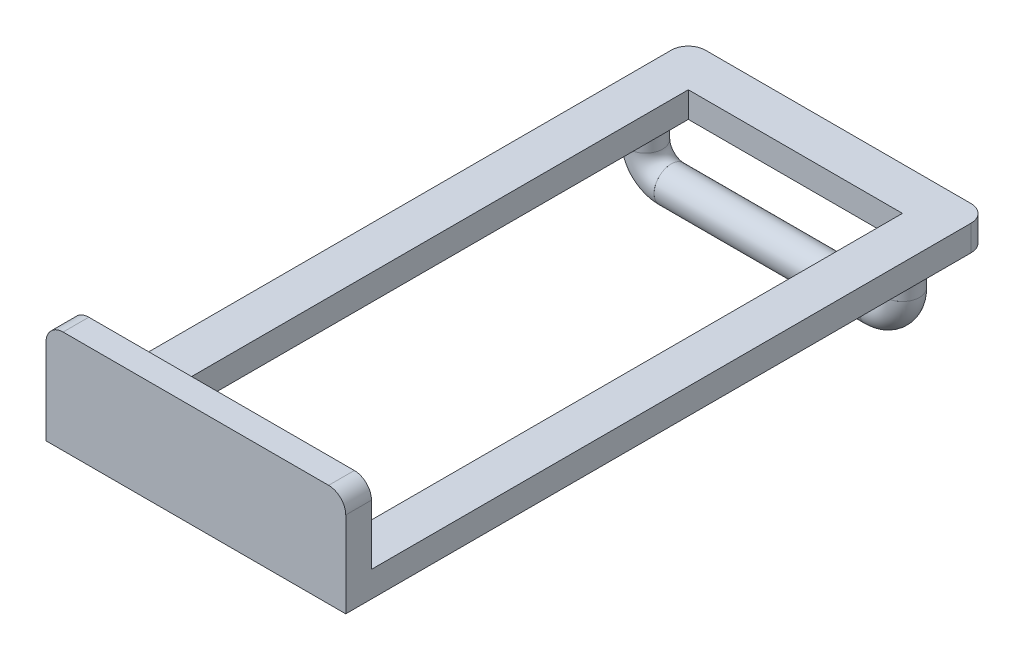
ISO-10303-21;
HEADER;
FILE_DESCRIPTION(('STEP AP214'),'2;1');
FILE_NAME('part.step','',(''),(''),'','','');
FILE_SCHEMA(('AUTOMOTIVE_DESIGN { 1 0 10303 214 1 1 1 1 }'));
ENDSEC;
DATA;
#1=APPLICATION_CONTEXT('core data for automotive mechanical design processes');
#2=APPLICATION_PROTOCOL_DEFINITION('international standard','automotive_design',2000,#1);
#3=PRODUCT_CONTEXT('',#1,'mechanical');
#4=PRODUCT('Part','Part','',(#3));
#5=PRODUCT_RELATED_PRODUCT_CATEGORY('part','',(#4));
#6=PRODUCT_DEFINITION_FORMATION('','',#4);
#7=PRODUCT_DEFINITION_CONTEXT('part definition',#1,'design');
#8=PRODUCT_DEFINITION('design','',#6,#7);
#9=PRODUCT_DEFINITION_SHAPE('','',#8);
#10=(LENGTH_UNIT() NAMED_UNIT(*) SI_UNIT(.MILLI.,.METRE.));
#11=(NAMED_UNIT(*) PLANE_ANGLE_UNIT() SI_UNIT($,.RADIAN.));
#12=(NAMED_UNIT(*) SI_UNIT($,.STERADIAN.) SOLID_ANGLE_UNIT());
#13=UNCERTAINTY_MEASURE_WITH_UNIT(LENGTH_MEASURE(1.E-05),#10,'distance_accuracy_value','');
#14=(GEOMETRIC_REPRESENTATION_CONTEXT(3) GLOBAL_UNCERTAINTY_ASSIGNED_CONTEXT((#13)) GLOBAL_UNIT_ASSIGNED_CONTEXT((#10,
#11,#12)) REPRESENTATION_CONTEXT('',''));
#15=CARTESIAN_POINT('',(0.,0.,0.));
#16=DIRECTION('',(0.,0.,1.));
#17=DIRECTION('',(1.,0.,0.));
#18=AXIS2_PLACEMENT_3D('',#15,#16,#17);
#19=CARTESIAN_POINT('',(-53.5028368420281,-4.77925095753517,-9.60826277193292));
#20=DIRECTION('',(0.,0.,1.));
#21=DIRECTION('',(0.,1.,0.));
#22=AXIS2_PLACEMENT_3D('',#19,#20,#21);
#23=TOROIDAL_SURFACE('',#22,3.,2.00320388081445);
#24=CARTESIAN_POINT('',(-56.502836842028,-4.77925095753517,-9.60826277193292));
#25=DIRECTION('',(0.,1.,0.));
#26=DIRECTION('',(0.,0.,-1.));
#27=AXIS2_PLACEMENT_3D('',#24,#25,#26);
#28=CIRCLE('',#27,2.00320388081445);
#29=CARTESIAN_POINT('',(-58.5060407228425,-4.77925095753517,-9.60826277193292));
#30=VERTEX_POINT('',#29);
#31=EDGE_CURVE('P0_E10',#30,#30,#28,.T.);
#32=CARTESIAN_POINT('',(-53.502836842028,-7.77925095753517,-9.60826277193292));
#33=DIRECTION('',(-1.,0.,0.));
#34=DIRECTION('',(0.,0.,-1.));
#35=AXIS2_PLACEMENT_3D('',#32,#33,#34);
#36=CIRCLE('',#35,2.00320388081445);
#37=CARTESIAN_POINT('',(-53.502836842028,-9.78245483834962,-9.60826277193292));
#38=VERTEX_POINT('',#37);
#39=EDGE_CURVE('P0_E21',#38,#38,#36,.T.);
#40=CARTESIAN_POINT('',(-53.5028368420281,-4.77925095753517,-9.60826277193292));
#41=DIRECTION('',(0.,0.,1.));
#42=DIRECTION('',(0.,1.,0.));
#43=AXIS2_PLACEMENT_3D('',#40,#41,#42);
#44=CIRCLE('',#43,5.00320388081445);
#45=EDGE_CURVE('',#30,#38,#44,.T.);
#46=ORIENTED_EDGE('',*,*,#31,.F.);
#47=ORIENTED_EDGE('',*,*,#39,.T.);
#48=ORIENTED_EDGE('',*,*,#45,.T.);
#49=ORIENTED_EDGE('',*,*,#45,.F.);
#50=EDGE_LOOP('',(#46,#48,#47,#49));
#51=FACE_BOUND('',#50,.T.);
#52=ADVANCED_FACE('P0_F15',(#51),#23,.T.);
#53=CARTESIAN_POINT('',(-56.502836842028,-4.77925095753517,-9.60826277193292));
#54=DIRECTION('',(0.,1.,0.));
#55=DIRECTION('',(0.,0.,-1.));
#56=AXIS2_PLACEMENT_3D('',#53,#54,#55);
#57=PLANE('',#56);
#58=ORIENTED_EDGE('',*,*,#31,.T.);
#59=EDGE_LOOP('',(#58));
#60=FACE_BOUND('',#59,.T.);
#61=ADVANCED_FACE('P0_F30',(#60),#57,.T.);
#62=CARTESIAN_POINT('',(-53.502836842028,-7.77925095753517,-9.60826277193292));
#63=DIRECTION('',(-1.,0.,0.));
#64=DIRECTION('',(0.,0.,-1.));
#65=AXIS2_PLACEMENT_3D('',#62,#63,#64);
#66=PLANE('',#65);
#67=ORIENTED_EDGE('',*,*,#39,.F.);
#68=EDGE_LOOP('',(#67));
#69=FACE_BOUND('',#68,.T.);
#70=ADVANCED_FACE('P0_F28',(#69),#66,.F.);
#71=CLOSED_SHELL('',(#52,#61,#70));
#72=MANIFOLD_SOLID_BREP('P0_B1',#71);
#73=CARTESIAN_POINT('',(-29.5028368420281,-4.77925095753496,-9.60826277193292));
#74=DIRECTION('',(0.,0.,1.));
#75=DIRECTION('',(-1.,0.,0.));
#76=AXIS2_PLACEMENT_3D('',#73,#74,#75);
#77=TOROIDAL_SURFACE('',#76,3.,2.00320388081445);
#78=CARTESIAN_POINT('',(-29.5028368420281,-7.77925095753496,-9.60826277193292));
#79=DIRECTION('',(-1.,0.,0.));
#80=DIRECTION('',(0.,0.,-1.));
#81=AXIS2_PLACEMENT_3D('',#78,#79,#80);
#82=CIRCLE('',#81,2.00320388081445);
#83=CARTESIAN_POINT('',(-29.5028368420281,-9.78245483834941,-9.60826277193292));
#84=VERTEX_POINT('',#83);
#85=EDGE_CURVE('P1_E10',#84,#84,#82,.T.);
#86=CARTESIAN_POINT('',(-26.5028368420281,-4.77925095753496,-9.60826277193292));
#87=DIRECTION('',(0.,-1.,0.));
#88=DIRECTION('',(0.,0.,-1.));
#89=AXIS2_PLACEMENT_3D('',#86,#87,#88);
#90=CIRCLE('',#89,2.00320388081445);
#91=CARTESIAN_POINT('',(-24.4996329612136,-4.77925095753496,-9.60826277193292));
#92=VERTEX_POINT('',#91);
#93=EDGE_CURVE('P1_E21',#92,#92,#90,.T.);
#94=CARTESIAN_POINT('',(-29.5028368420281,-4.77925095753496,-9.60826277193292));
#95=DIRECTION('',(0.,0.,1.));
#96=DIRECTION('',(-1.,0.,0.));
#97=AXIS2_PLACEMENT_3D('',#94,#95,#96);
#98=CIRCLE('',#97,5.00320388081445);
#99=EDGE_CURVE('',#84,#92,#98,.T.);
#100=ORIENTED_EDGE('',*,*,#85,.F.);
#101=ORIENTED_EDGE('',*,*,#93,.T.);
#102=ORIENTED_EDGE('',*,*,#99,.T.);
#103=ORIENTED_EDGE('',*,*,#99,.F.);
#104=EDGE_LOOP('',(#100,#102,#101,#103));
#105=FACE_BOUND('',#104,.T.);
#106=ADVANCED_FACE('P1_F15',(#105),#77,.T.);
#107=CARTESIAN_POINT('',(-29.5028368420281,-7.77925095753496,-9.60826277193292));
#108=DIRECTION('',(-1.,0.,0.));
#109=DIRECTION('',(0.,0.,-1.));
#110=AXIS2_PLACEMENT_3D('',#107,#108,#109);
#111=PLANE('',#110);
#112=ORIENTED_EDGE('',*,*,#85,.T.);
#113=EDGE_LOOP('',(#112));
#114=FACE_BOUND('',#113,.T.);
#115=ADVANCED_FACE('P1_F30',(#114),#111,.T.);
#116=CARTESIAN_POINT('',(-26.5028368420281,-4.77925095753496,-9.60826277193292));
#117=DIRECTION('',(0.,-1.,0.));
#118=DIRECTION('',(0.,0.,-1.));
#119=AXIS2_PLACEMENT_3D('',#116,#117,#118);
#120=PLANE('',#119);
#121=ORIENTED_EDGE('',*,*,#93,.F.);
#122=EDGE_LOOP('',(#121));
#123=FACE_BOUND('',#122,.T.);
#124=ADVANCED_FACE('P1_F28',(#123),#120,.F.);
#125=CLOSED_SHELL('',(#106,#115,#124));
#126=MANIFOLD_SOLID_BREP('P1_B1',#125);
#127=CARTESIAN_POINT('',(-24.002836842028,0.220749042464831,-17.1082627719329));
#128=DIRECTION('',(-1.,0.,0.));
#129=DIRECTION('',(0.,0.,1.));
#130=AXIS2_PLACEMENT_3D('',#127,#128,#129);
#131=PLANE('',#130);
#132=DIRECTION('',(0.,-1.,0.));
#133=VECTOR('',#132,1.);
#134=CARTESIAN_POINT('',(-24.002836842028,9.22074904246483,54.8917372280671));
#135=LINE('',#134,#133);
#136=CARTESIAN_POINT('',(-24.002836842028,7.22074904246483,54.8917372280671));
#137=VERTEX_POINT('',#136);
#138=CARTESIAN_POINT('',(-24.002836842028,0.220749042464831,54.8917372280671));
#139=VERTEX_POINT('',#138);
#140=EDGE_CURVE('P2_E141',#137,#139,#135,.T.);
#141=ORIENTED_EDGE('',*,*,#140,.F.);
#142=DIRECTION('',(0.,0.,-1.));
#143=VECTOR('',#142,1.);
#144=CARTESIAN_POINT('',(-24.002836842028,7.22074904246483,57.8917372280671));
#145=LINE('',#144,#143);
#146=CARTESIAN_POINT('',(-24.002836842028,7.22074904246483,57.8917372280671));
#147=VERTEX_POINT('',#146);
#148=EDGE_CURVE('P2_E225',#137,#147,#145,.F.);
#149=ORIENTED_EDGE('',*,*,#148,.T.);
#150=DIRECTION('',(0.,-1.,0.));
#151=VECTOR('',#150,1.);
#152=CARTESIAN_POINT('',(-24.002836842028,0.220749042464831,57.8917372280671));
#153=LINE('',#152,#151);
#154=CARTESIAN_POINT('',(-24.002836842028,-2.77925095753517,57.8917372280671));
#155=VERTEX_POINT('',#154);
#156=EDGE_CURVE('P2_E130',#147,#155,#153,.T.);
#157=ORIENTED_EDGE('',*,*,#156,.T.);
#158=DIRECTION('',(0.,0.,-1.));
#159=VECTOR('',#158,1.);
#160=CARTESIAN_POINT('',(-24.002836842028,-2.77925095753517,-17.1082627719329));
#161=LINE('',#160,#159);
#162=CARTESIAN_POINT('',(-24.002836842028,-2.77925095753517,-15.1082627719329));
#163=VERTEX_POINT('',#162);
#164=EDGE_CURVE('P2_E183',#155,#163,#161,.T.);
#165=ORIENTED_EDGE('',*,*,#164,.T.);
#166=DIRECTION('',(0.,-1.,0.));
#167=VECTOR('',#166,1.);
#168=CARTESIAN_POINT('',(-24.002836842028,0.220749042464831,-15.1082627719329));
#169=LINE('',#168,#167);
#170=CARTESIAN_POINT('',(-24.002836842028,0.220749042464831,-15.1082627719329));
#171=VERTEX_POINT('',#170);
#172=EDGE_CURVE('P2_E223',#163,#171,#169,.F.);
#173=ORIENTED_EDGE('',*,*,#172,.T.);
#174=DIRECTION('',(0.,0.,-1.));
#175=VECTOR('',#174,1.);
#176=CARTESIAN_POINT('',(-24.002836842028,0.220749042464831,-17.1082627719329));
#177=LINE('',#176,#175);
#178=EDGE_CURVE('P2_E190',#139,#171,#177,.T.);
#179=ORIENTED_EDGE('',*,*,#178,.F.);
#180=EDGE_LOOP('',(#141,#149,#157,#165,#173,#179));
#181=FACE_BOUND('',#180,.T.);
#182=ADVANCED_FACE('P2_F16',(#181),#131,.F.);
#183=CARTESIAN_POINT('',(-59.002836842028,0.220749042464831,-17.1082627719329));
#184=DIRECTION('',(0.,0.,1.));
#185=DIRECTION('',(1.,0.,0.));
#186=AXIS2_PLACEMENT_3D('',#183,#184,#185);
#187=PLANE('',#186);
#188=DIRECTION('',(-1.,0.,0.));
#189=VECTOR('',#188,1.);
#190=CARTESIAN_POINT('',(-59.002836842028,-2.77925095753517,-17.1082627719329));
#191=LINE('',#190,#189);
#192=CARTESIAN_POINT('',(-26.002836842028,-2.77925095753517,-17.1082627719329));
#193=VERTEX_POINT('',#192);
#194=CARTESIAN_POINT('',(-57.0028368420281,-2.77925095753517,-17.1082627719329));
#195=VERTEX_POINT('',#194);
#196=EDGE_CURVE('P2_E196',#193,#195,#191,.T.);
#197=ORIENTED_EDGE('',*,*,#196,.T.);
#198=DIRECTION('',(0.,-1.,0.));
#199=VECTOR('',#198,1.);
#200=CARTESIAN_POINT('',(-57.0028368420281,0.220749042464831,-17.1082627719329));
#201=LINE('',#200,#199);
#202=CARTESIAN_POINT('',(-57.0028368420281,0.220749042464831,-17.1082627719329));
#203=VERTEX_POINT('',#202);
#204=EDGE_CURVE('P2_E31',#195,#203,#201,.F.);
#205=ORIENTED_EDGE('',*,*,#204,.T.);
#206=DIRECTION('',(-1.,0.,0.));
#207=VECTOR('',#206,1.);
#208=CARTESIAN_POINT('',(-59.002836842028,0.220749042464831,-17.1082627719329));
#209=LINE('',#208,#207);
#210=CARTESIAN_POINT('',(-26.002836842028,0.220749042464831,-17.1082627719329));
#211=VERTEX_POINT('',#210);
#212=EDGE_CURVE('P2_E131',#211,#203,#209,.T.);
#213=ORIENTED_EDGE('',*,*,#212,.F.);
#214=DIRECTION('',(0.,-1.,0.));
#215=VECTOR('',#214,1.);
#216=CARTESIAN_POINT('',(-26.002836842028,0.220749042464831,-17.1082627719329));
#217=LINE('',#216,#215);
#218=EDGE_CURVE('P2_E231',#211,#193,#217,.T.);
#219=ORIENTED_EDGE('',*,*,#218,.T.);
#220=EDGE_LOOP('',(#197,#205,#213,#219));
#221=FACE_BOUND('',#220,.T.);
#222=ADVANCED_FACE('P2_F273',(#221),#187,.F.);
#223=CARTESIAN_POINT('',(-59.002836842028,0.220749042464831,-17.1082627719329));
#224=DIRECTION('',(1.,0.,0.));
#225=DIRECTION('',(0.,0.,-1.));
#226=AXIS2_PLACEMENT_3D('',#223,#224,#225);
#227=PLANE('',#226);
#228=DIRECTION('',(0.,-1.,0.));
#229=VECTOR('',#228,1.);
#230=CARTESIAN_POINT('',(-59.002836842028,0.220749042464831,57.8917372280671));
#231=LINE('',#230,#229);
#232=CARTESIAN_POINT('',(-59.002836842028,7.22074904246483,57.8917372280671));
#233=VERTEX_POINT('',#232);
#234=CARTESIAN_POINT('',(-59.002836842028,-2.77925095753517,57.8917372280671));
#235=VERTEX_POINT('',#234);
#236=EDGE_CURVE('P2_E203',#233,#235,#231,.T.);
#237=ORIENTED_EDGE('',*,*,#236,.F.);
#238=DIRECTION('',(0.,0.,1.));
#239=VECTOR('',#238,1.);
#240=CARTESIAN_POINT('',(-59.002836842028,7.22074904246483,54.8917372280671));
#241=LINE('',#240,#239);
#242=CARTESIAN_POINT('',(-59.0028368420281,7.22074904246483,54.8917372280671));
#243=VERTEX_POINT('',#242);
#244=EDGE_CURVE('P2_E138',#233,#243,#241,.F.);
#245=ORIENTED_EDGE('',*,*,#244,.T.);
#246=DIRECTION('',(0.,-1.,0.));
#247=VECTOR('',#246,1.);
#248=CARTESIAN_POINT('',(-59.0028368420281,9.22074904246483,54.8917372280671));
#249=LINE('',#248,#247);
#250=CARTESIAN_POINT('',(-59.0028368420281,0.220749042464831,54.8917372280671));
#251=VERTEX_POINT('',#250);
#252=EDGE_CURVE('P2_E134',#243,#251,#249,.T.);
#253=ORIENTED_EDGE('',*,*,#252,.T.);
#254=DIRECTION('',(0.,0.,1.));
#255=VECTOR('',#254,1.);
#256=CARTESIAN_POINT('',(-59.002836842028,0.220749042464831,-17.1082627719329));
#257=LINE('',#256,#255);
#258=CARTESIAN_POINT('',(-59.002836842028,0.220749042464831,-15.1082627719329));
#259=VERTEX_POINT('',#258);
#260=EDGE_CURVE('P2_E118',#259,#251,#257,.T.);
#261=ORIENTED_EDGE('',*,*,#260,.F.);
#262=DIRECTION('',(0.,-1.,0.));
#263=VECTOR('',#262,1.);
#264=CARTESIAN_POINT('',(-59.002836842028,0.220749042464831,-15.1082627719329));
#265=LINE('',#264,#263);
#266=CARTESIAN_POINT('',(-59.002836842028,-2.77925095753517,-15.1082627719329));
#267=VERTEX_POINT('',#266);
#268=EDGE_CURVE('P2_E216',#259,#267,#265,.T.);
#269=ORIENTED_EDGE('',*,*,#268,.T.);
#270=DIRECTION('',(0.,0.,1.));
#271=VECTOR('',#270,1.);
#272=CARTESIAN_POINT('',(-59.002836842028,-2.77925095753517,-17.1082627719329));
#273=LINE('',#272,#271);
#274=EDGE_CURVE('P2_E198',#267,#235,#273,.T.);
#275=ORIENTED_EDGE('',*,*,#274,.T.);
#276=EDGE_LOOP('',(#237,#245,#253,#261,#269,#275));
#277=FACE_BOUND('',#276,.T.);
#278=ADVANCED_FACE('P2_F136',(#277),#227,.F.);
#279=CARTESIAN_POINT('',(-59.002836842028,0.220749042464831,57.8917372280671));
#280=DIRECTION('',(0.,0.,-1.));
#281=DIRECTION('',(-1.,0.,0.));
#282=AXIS2_PLACEMENT_3D('',#279,#280,#281);
#283=PLANE('',#282);
#284=DIRECTION('',(1.,0.,0.));
#285=VECTOR('',#284,1.);
#286=CARTESIAN_POINT('',(-59.0028368420281,9.22074904246483,57.8917372280671));
#287=LINE('',#286,#285);
#288=CARTESIAN_POINT('',(-57.002836842028,9.22074904246483,57.8917372280671));
#289=VERTEX_POINT('',#288);
#290=CARTESIAN_POINT('',(-26.002836842028,9.22074904246483,57.8917372280671));
#291=VERTEX_POINT('',#290);
#292=EDGE_CURVE('P2_E142',#289,#291,#287,.T.);
#293=ORIENTED_EDGE('',*,*,#292,.F.);
#294=CARTESIAN_POINT('',(-57.002836842028,7.22074904246483,57.8917372280671));
#295=DIRECTION('',(0.,0.,-1.));
#296=DIRECTION('',(-1.,0.,0.));
#297=AXIS2_PLACEMENT_3D('',#294,#295,#296);
#298=CIRCLE('',#297,2.);
#299=EDGE_CURVE('P2_E214',#289,#233,#298,.F.);
#300=ORIENTED_EDGE('',*,*,#299,.T.);
#301=ORIENTED_EDGE('',*,*,#236,.T.);
#302=DIRECTION('',(1.,0.,0.));
#303=VECTOR('',#302,1.);
#304=CARTESIAN_POINT('',(-59.002836842028,-2.77925095753517,57.8917372280671));
#305=LINE('',#304,#303);
#306=EDGE_CURVE('P2_E192',#235,#155,#305,.T.);
#307=ORIENTED_EDGE('',*,*,#306,.T.);
#308=ORIENTED_EDGE('',*,*,#156,.F.);
#309=CARTESIAN_POINT('',(-26.002836842028,7.22074904246483,57.8917372280671));
#310=DIRECTION('',(0.,0.,-1.));
#311=DIRECTION('',(-1.,0.,0.));
#312=AXIS2_PLACEMENT_3D('',#309,#310,#311);
#313=CIRCLE('',#312,2.);
#314=EDGE_CURVE('P2_E212',#147,#291,#313,.F.);
#315=ORIENTED_EDGE('',*,*,#314,.T.);
#316=EDGE_LOOP('',(#293,#300,#301,#307,#308,#315));
#317=FACE_BOUND('',#316,.T.);
#318=ADVANCED_FACE('P2_F255',(#317),#283,.F.);
#319=CARTESIAN_POINT('',(-41.502836842028,0.220749042464831,20.3917372280671));
#320=DIRECTION('',(0.,1.,0.));
#321=DIRECTION('',(0.,0.,1.));
#322=AXIS2_PLACEMENT_3D('',#319,#320,#321);
#323=PLANE('',#322);
#324=ORIENTED_EDGE('',*,*,#212,.T.);
#325=CARTESIAN_POINT('',(-57.0028368420281,0.220749042464831,-15.1082627719329));
#326=DIRECTION('',(0.,1.,0.));
#327=DIRECTION('',(0.,0.,1.));
#328=AXIS2_PLACEMENT_3D('',#325,#326,#327);
#329=CIRCLE('',#328,2.);
#330=EDGE_CURVE('P2_E126',#203,#259,#329,.T.);
#331=ORIENTED_EDGE('',*,*,#330,.T.);
#332=ORIENTED_EDGE('',*,*,#260,.T.);
#333=DIRECTION('',(-1.,0.,0.));
#334=VECTOR('',#333,1.);
#335=CARTESIAN_POINT('',(-59.0028368420281,0.220749042464831,54.8917372280671));
#336=LINE('',#335,#334);
#337=EDGE_CURVE('P2_E123',#139,#251,#336,.T.);
#338=ORIENTED_EDGE('',*,*,#337,.F.);
#339=ORIENTED_EDGE('',*,*,#178,.T.);
#340=CARTESIAN_POINT('',(-26.002836842028,0.220749042464831,-15.1082627719329));
#341=DIRECTION('',(0.,1.,0.));
#342=DIRECTION('',(0.,0.,1.));
#343=AXIS2_PLACEMENT_3D('',#340,#341,#342);
#344=CIRCLE('',#343,2.);
#345=EDGE_CURVE('P2_E38',#171,#211,#344,.T.);
#346=ORIENTED_EDGE('',*,*,#345,.T.);
#347=EDGE_LOOP('',(#324,#331,#332,#338,#339,#346));
#348=FACE_BOUND('',#347,.T.);
#349=DIRECTION('',(0.,0.,-1.));
#350=VECTOR('',#349,1.);
#351=CARTESIAN_POINT('',(-29.002836842028,0.220749042464831,-12.1082627719329));
#352=LINE('',#351,#350);
#353=CARTESIAN_POINT('',(-29.002836842028,0.220749042464831,52.8917372280671));
#354=VERTEX_POINT('',#353);
#355=CARTESIAN_POINT('',(-29.002836842028,0.220749042464831,-12.1082627719329));
#356=VERTEX_POINT('',#355);
#357=EDGE_CURVE('P2_E157',#354,#356,#352,.T.);
#358=ORIENTED_EDGE('',*,*,#357,.F.);
#359=DIRECTION('',(1.,0.,0.));
#360=VECTOR('',#359,1.);
#361=CARTESIAN_POINT('',(-54.0028368420281,0.220749042464831,52.8917372280671));
#362=LINE('',#361,#360);
#363=CARTESIAN_POINT('',(-54.0028368420281,0.220749042464831,52.8917372280671));
#364=VERTEX_POINT('',#363);
#365=EDGE_CURVE('P2_E162',#364,#354,#362,.T.);
#366=ORIENTED_EDGE('',*,*,#365,.F.);
#367=DIRECTION('',(0.,0.,1.));
#368=VECTOR('',#367,1.);
#369=CARTESIAN_POINT('',(-54.0028368420281,0.220749042464831,-12.1082627719329));
#370=LINE('',#369,#368);
#371=CARTESIAN_POINT('',(-54.0028368420281,0.220749042464831,-12.1082627719329));
#372=VERTEX_POINT('',#371);
#373=EDGE_CURVE('P2_E176',#372,#364,#370,.T.);
#374=ORIENTED_EDGE('',*,*,#373,.F.);
#375=DIRECTION('',(-1.,0.,0.));
#376=VECTOR('',#375,1.);
#377=CARTESIAN_POINT('',(-54.0028368420281,0.220749042464831,-12.1082627719329));
#378=LINE('',#377,#376);
#379=EDGE_CURVE('P2_E173',#356,#372,#378,.T.);
#380=ORIENTED_EDGE('',*,*,#379,.F.);
#381=EDGE_LOOP('',(#358,#366,#374,#380));
#382=FACE_BOUND('',#381,.T.);
#383=ADVANCED_FACE('P2_F120',(#348,#382),#323,.T.);
#384=CARTESIAN_POINT('',(-41.502836842028,-2.77925095753517,20.3917372280671));
#385=DIRECTION('',(0.,1.,0.));
#386=DIRECTION('',(0.,0.,1.));
#387=AXIS2_PLACEMENT_3D('',#384,#385,#386);
#388=PLANE('',#387);
#389=CARTESIAN_POINT('',(-56.5028368420281,-2.77925095753517,-9.60826277193292));
#390=DIRECTION('',(0.,1.,0.));
#391=DIRECTION('',(0.,0.,1.));
#392=AXIS2_PLACEMENT_3D('',#389,#390,#391);
#393=CIRCLE('',#392,2.);
#394=CARTESIAN_POINT('',(-56.5028368420281,-2.77925095753517,-7.60826277193291));
#395=VERTEX_POINT('',#394);
#396=EDGE_CURVE('P2_E11',#395,#395,#393,.F.);
#397=ORIENTED_EDGE('',*,*,#396,.F.);
#398=EDGE_LOOP('',(#397));
#399=FACE_BOUND('',#398,.T.);
#400=CARTESIAN_POINT('',(-26.502836842028,-2.77925095753517,-9.60826277193291));
#401=DIRECTION('',(0.,1.,0.));
#402=DIRECTION('',(0.,0.,1.));
#403=AXIS2_PLACEMENT_3D('',#400,#401,#402);
#404=CIRCLE('',#403,2.);
#405=CARTESIAN_POINT('',(-26.502836842028,-2.77925095753517,-7.60826277193291));
#406=VERTEX_POINT('',#405);
#407=EDGE_CURVE('P2_E24',#406,#406,#404,.F.);
#408=ORIENTED_EDGE('',*,*,#407,.F.);
#409=EDGE_LOOP('',(#408));
#410=FACE_BOUND('',#409,.T.);
#411=DIRECTION('',(1.,0.,0.));
#412=VECTOR('',#411,1.);
#413=CARTESIAN_POINT('',(-54.0028368420281,-2.77925095753517,52.8917372280671));
#414=LINE('',#413,#412);
#415=CARTESIAN_POINT('',(-54.0028368420281,-2.77925095753517,52.8917372280671));
#416=VERTEX_POINT('',#415);
#417=CARTESIAN_POINT('',(-29.002836842028,-2.77925095753517,52.8917372280671));
#418=VERTEX_POINT('',#417);
#419=EDGE_CURVE('P2_E168',#416,#418,#414,.T.);
#420=ORIENTED_EDGE('',*,*,#419,.T.);
#421=DIRECTION('',(0.,0.,-1.));
#422=VECTOR('',#421,1.);
#423=CARTESIAN_POINT('',(-29.002836842028,-2.77925095753517,-12.1082627719329));
#424=LINE('',#423,#422);
#425=CARTESIAN_POINT('',(-29.002836842028,-2.77925095753517,-12.1082627719329));
#426=VERTEX_POINT('',#425);
#427=EDGE_CURVE('P2_E158',#418,#426,#424,.T.);
#428=ORIENTED_EDGE('',*,*,#427,.T.);
#429=DIRECTION('',(-1.,0.,0.));
#430=VECTOR('',#429,1.);
#431=CARTESIAN_POINT('',(-54.0028368420281,-2.77925095753517,-12.1082627719329));
#432=LINE('',#431,#430);
#433=CARTESIAN_POINT('',(-54.0028368420281,-2.77925095753517,-12.1082627719329));
#434=VERTEX_POINT('',#433);
#435=EDGE_CURVE('P2_E161',#426,#434,#432,.T.);
#436=ORIENTED_EDGE('',*,*,#435,.T.);
#437=DIRECTION('',(0.,0.,1.));
#438=VECTOR('',#437,1.);
#439=CARTESIAN_POINT('',(-54.0028368420281,-2.77925095753517,-12.1082627719329));
#440=LINE('',#439,#438);
#441=EDGE_CURVE('P2_E165',#434,#416,#440,.T.);
#442=ORIENTED_EDGE('',*,*,#441,.T.);
#443=EDGE_LOOP('',(#420,#428,#436,#442));
#444=FACE_BOUND('',#443,.T.);
#445=ORIENTED_EDGE('',*,*,#274,.F.);
#446=CARTESIAN_POINT('',(-57.0028368420281,-2.77925095753517,-15.1082627719329));
#447=DIRECTION('',(0.,1.,0.));
#448=DIRECTION('',(0.,0.,1.));
#449=AXIS2_PLACEMENT_3D('',#446,#447,#448);
#450=CIRCLE('',#449,2.);
#451=EDGE_CURVE('P2_E229',#267,#195,#450,.F.);
#452=ORIENTED_EDGE('',*,*,#451,.T.);
#453=ORIENTED_EDGE('',*,*,#196,.F.);
#454=CARTESIAN_POINT('',(-26.002836842028,-2.77925095753517,-15.1082627719329));
#455=DIRECTION('',(0.,1.,0.));
#456=DIRECTION('',(0.,0.,1.));
#457=AXIS2_PLACEMENT_3D('',#454,#455,#456);
#458=CIRCLE('',#457,2.);
#459=EDGE_CURVE('P2_E227',#193,#163,#458,.F.);
#460=ORIENTED_EDGE('',*,*,#459,.T.);
#461=ORIENTED_EDGE('',*,*,#164,.F.);
#462=ORIENTED_EDGE('',*,*,#306,.F.);
#463=EDGE_LOOP('',(#445,#452,#453,#460,#461,#462));
#464=FACE_BOUND('',#463,.T.);
#465=ADVANCED_FACE('P2_F241',(#399,#410,#444,#464),#388,.F.);
#466=CARTESIAN_POINT('',(-29.002836842028,-2.77925095753517,-12.1082627719329));
#467=DIRECTION('',(1.,0.,0.));
#468=DIRECTION('',(0.,0.,-1.));
#469=AXIS2_PLACEMENT_3D('',#466,#467,#468);
#470=PLANE('',#469);
#471=ORIENTED_EDGE('',*,*,#357,.T.);
#472=DIRECTION('',(0.,1.,0.));
#473=VECTOR('',#472,1.);
#474=CARTESIAN_POINT('',(-29.002836842028,-2.77925095753517,-12.1082627719329));
#475=LINE('',#474,#473);
#476=EDGE_CURVE('P2_E171',#426,#356,#475,.T.);
#477=ORIENTED_EDGE('',*,*,#476,.F.);
#478=ORIENTED_EDGE('',*,*,#427,.F.);
#479=DIRECTION('',(0.,1.,0.));
#480=VECTOR('',#479,1.);
#481=CARTESIAN_POINT('',(-29.002836842028,-2.77925095753517,52.8917372280671));
#482=LINE('',#481,#480);
#483=EDGE_CURVE('P2_E181',#418,#354,#482,.T.);
#484=ORIENTED_EDGE('',*,*,#483,.T.);
#485=EDGE_LOOP('',(#471,#477,#478,#484));
#486=FACE_BOUND('',#485,.T.);
#487=ADVANCED_FACE('P2_F244',(#486),#470,.F.);
#488=CARTESIAN_POINT('',(-54.0028368420281,-2.77925095753517,52.8917372280671));
#489=DIRECTION('',(0.,0.,1.));
#490=DIRECTION('',(1.,0.,0.));
#491=AXIS2_PLACEMENT_3D('',#488,#489,#490);
#492=PLANE('',#491);
#493=ORIENTED_EDGE('',*,*,#365,.T.);
#494=ORIENTED_EDGE('',*,*,#483,.F.);
#495=ORIENTED_EDGE('',*,*,#419,.F.);
#496=DIRECTION('',(0.,1.,0.));
#497=VECTOR('',#496,1.);
#498=CARTESIAN_POINT('',(-54.0028368420281,-2.77925095753517,52.8917372280671));
#499=LINE('',#498,#497);
#500=EDGE_CURVE('P2_E184',#416,#364,#499,.T.);
#501=ORIENTED_EDGE('',*,*,#500,.T.);
#502=EDGE_LOOP('',(#493,#494,#495,#501));
#503=FACE_BOUND('',#502,.T.);
#504=ADVANCED_FACE('P2_F304',(#503),#492,.F.);
#505=CARTESIAN_POINT('',(-54.0028368420281,-2.77925095753517,-12.1082627719329));
#506=DIRECTION('',(-1.,0.,0.));
#507=DIRECTION('',(0.,0.,1.));
#508=AXIS2_PLACEMENT_3D('',#505,#506,#507);
#509=PLANE('',#508);
#510=ORIENTED_EDGE('',*,*,#373,.T.);
#511=ORIENTED_EDGE('',*,*,#500,.F.);
#512=ORIENTED_EDGE('',*,*,#441,.F.);
#513=DIRECTION('',(0.,1.,0.));
#514=VECTOR('',#513,1.);
#515=CARTESIAN_POINT('',(-54.0028368420281,-2.77925095753517,-12.1082627719329));
#516=LINE('',#515,#514);
#517=EDGE_CURVE('P2_E186',#434,#372,#516,.T.);
#518=ORIENTED_EDGE('',*,*,#517,.T.);
#519=EDGE_LOOP('',(#510,#511,#512,#518));
#520=FACE_BOUND('',#519,.T.);
#521=ADVANCED_FACE('P2_F307',(#520),#509,.F.);
#522=CARTESIAN_POINT('',(-54.0028368420281,-2.77925095753517,-12.1082627719329));
#523=DIRECTION('',(0.,0.,-1.));
#524=DIRECTION('',(-1.,0.,0.));
#525=AXIS2_PLACEMENT_3D('',#522,#523,#524);
#526=PLANE('',#525);
#527=ORIENTED_EDGE('',*,*,#379,.T.);
#528=ORIENTED_EDGE('',*,*,#517,.F.);
#529=ORIENTED_EDGE('',*,*,#435,.F.);
#530=ORIENTED_EDGE('',*,*,#476,.T.);
#531=EDGE_LOOP('',(#527,#528,#529,#530));
#532=FACE_BOUND('',#531,.T.);
#533=ADVANCED_FACE('P2_F299',(#532),#526,.F.);
#534=CARTESIAN_POINT('',(-59.0028368420281,9.22074904246483,54.8917372280671));
#535=DIRECTION('',(0.,0.,1.));
#536=DIRECTION('',(1.,0.,0.));
#537=AXIS2_PLACEMENT_3D('',#534,#535,#536);
#538=PLANE('',#537);
#539=ORIENTED_EDGE('',*,*,#252,.F.);
#540=CARTESIAN_POINT('',(-57.002836842028,7.22074904246483,54.8917372280671));
#541=DIRECTION('',(0.,0.,1.));
#542=DIRECTION('',(1.,0.,0.));
#543=AXIS2_PLACEMENT_3D('',#540,#541,#542);
#544=CIRCLE('',#543,2.);
#545=CARTESIAN_POINT('',(-57.002836842028,9.22074904246483,54.8917372280671));
#546=VERTEX_POINT('',#545);
#547=EDGE_CURVE('P2_E221',#243,#546,#544,.F.);
#548=ORIENTED_EDGE('',*,*,#547,.T.);
#549=DIRECTION('',(-1.,0.,0.));
#550=VECTOR('',#549,1.);
#551=CARTESIAN_POINT('',(-59.0028368420281,9.22074904246483,54.8917372280671));
#552=LINE('',#551,#550);
#553=CARTESIAN_POINT('',(-26.002836842028,9.22074904246483,54.8917372280671));
#554=VERTEX_POINT('',#553);
#555=EDGE_CURVE('P2_E146',#554,#546,#552,.T.);
#556=ORIENTED_EDGE('',*,*,#555,.F.);
#557=CARTESIAN_POINT('',(-26.002836842028,7.22074904246483,54.8917372280671));
#558=DIRECTION('',(0.,0.,1.));
#559=DIRECTION('',(1.,0.,0.));
#560=AXIS2_PLACEMENT_3D('',#557,#558,#559);
#561=CIRCLE('',#560,2.);
#562=EDGE_CURVE('P2_E219',#554,#137,#561,.F.);
#563=ORIENTED_EDGE('',*,*,#562,.T.);
#564=ORIENTED_EDGE('',*,*,#140,.T.);
#565=ORIENTED_EDGE('',*,*,#337,.T.);
#566=EDGE_LOOP('',(#539,#548,#556,#563,#564,#565));
#567=FACE_BOUND('',#566,.T.);
#568=ADVANCED_FACE('P2_F144',(#567),#538,.F.);
#569=CARTESIAN_POINT('',(-41.502836842028,9.22074904246483,20.3917372280671));
#570=DIRECTION('',(0.,1.,0.));
#571=DIRECTION('',(0.,0.,1.));
#572=AXIS2_PLACEMENT_3D('',#569,#570,#571);
#573=PLANE('',#572);
#574=ORIENTED_EDGE('',*,*,#555,.T.);
#575=DIRECTION('',(0.,0.,1.));
#576=VECTOR('',#575,1.);
#577=CARTESIAN_POINT('',(-57.002836842028,9.22074904246483,57.8917372280671));
#578=LINE('',#577,#576);
#579=EDGE_CURVE('P2_E209',#546,#289,#578,.T.);
#580=ORIENTED_EDGE('',*,*,#579,.T.);
#581=ORIENTED_EDGE('',*,*,#292,.T.);
#582=DIRECTION('',(0.,0.,-1.));
#583=VECTOR('',#582,1.);
#584=CARTESIAN_POINT('',(-26.002836842028,9.22074904246483,54.8917372280671));
#585=LINE('',#584,#583);
#586=EDGE_CURVE('P2_E206',#291,#554,#585,.T.);
#587=ORIENTED_EDGE('',*,*,#586,.T.);
#588=EDGE_LOOP('',(#574,#580,#581,#587));
#589=FACE_BOUND('',#588,.T.);
#590=ADVANCED_FACE('P2_F262',(#589),#573,.T.);
#591=CARTESIAN_POINT('',(-57.002836842028,7.22074904246483,20.3917372280671));
#592=DIRECTION('',(0.,0.,-1.));
#593=DIRECTION('',(-1.,0.,0.));
#594=AXIS2_PLACEMENT_3D('',#591,#592,#593);
#595=CYLINDRICAL_SURFACE('',#594,2.);
#596=ORIENTED_EDGE('',*,*,#547,.F.);
#597=ORIENTED_EDGE('',*,*,#244,.F.);
#598=ORIENTED_EDGE('',*,*,#299,.F.);
#599=ORIENTED_EDGE('',*,*,#579,.F.);
#600=EDGE_LOOP('',(#596,#597,#598,#599));
#601=FACE_BOUND('',#600,.T.);
#602=ADVANCED_FACE('P2_F260',(#601),#595,.T.);
#603=CARTESIAN_POINT('',(-26.002836842028,7.22074904246483,20.3917372280671));
#604=DIRECTION('',(0.,0.,1.));
#605=DIRECTION('',(1.,0.,0.));
#606=AXIS2_PLACEMENT_3D('',#603,#604,#605);
#607=CYLINDRICAL_SURFACE('',#606,2.);
#608=ORIENTED_EDGE('',*,*,#314,.F.);
#609=ORIENTED_EDGE('',*,*,#148,.F.);
#610=ORIENTED_EDGE('',*,*,#562,.F.);
#611=ORIENTED_EDGE('',*,*,#586,.F.);
#612=EDGE_LOOP('',(#608,#609,#610,#611));
#613=FACE_BOUND('',#612,.T.);
#614=ADVANCED_FACE('P2_F269',(#613),#607,.T.);
#615=CARTESIAN_POINT('',(-57.0028368420281,0.220749042464831,-15.1082627719329));
#616=DIRECTION('',(0.,-1.,0.));
#617=DIRECTION('',(0.,0.,-1.));
#618=AXIS2_PLACEMENT_3D('',#615,#616,#617);
#619=CYLINDRICAL_SURFACE('',#618,2.);
#620=ORIENTED_EDGE('',*,*,#330,.F.);
#621=ORIENTED_EDGE('',*,*,#204,.F.);
#622=ORIENTED_EDGE('',*,*,#451,.F.);
#623=ORIENTED_EDGE('',*,*,#268,.F.);
#624=EDGE_LOOP('',(#620,#621,#622,#623));
#625=FACE_BOUND('',#624,.T.);
#626=ADVANCED_FACE('P2_F275',(#625),#619,.T.);
#627=CARTESIAN_POINT('',(-26.002836842028,0.220749042464831,-15.1082627719329));
#628=DIRECTION('',(0.,-1.,0.));
#629=DIRECTION('',(0.,0.,-1.));
#630=AXIS2_PLACEMENT_3D('',#627,#628,#629);
#631=CYLINDRICAL_SURFACE('',#630,2.);
#632=ORIENTED_EDGE('',*,*,#345,.F.);
#633=ORIENTED_EDGE('',*,*,#172,.F.);
#634=ORIENTED_EDGE('',*,*,#459,.F.);
#635=ORIENTED_EDGE('',*,*,#218,.F.);
#636=EDGE_LOOP('',(#632,#633,#634,#635));
#637=FACE_BOUND('',#636,.T.);
#638=ADVANCED_FACE('P2_F18',(#637),#631,.T.);
#639=CARTESIAN_POINT('',(-26.502836842028,-4.77925095753517,-9.60826277193291));
#640=DIRECTION('',(0.,1.,0.));
#641=DIRECTION('',(0.,0.,1.));
#642=AXIS2_PLACEMENT_3D('',#639,#640,#641);
#643=CYLINDRICAL_SURFACE('',#642,2.);
#644=CARTESIAN_POINT('',(-26.502836842028,-4.77925095753517,-9.60826277193291));
#645=DIRECTION('',(0.,-1.,0.));
#646=DIRECTION('',(0.,0.,-1.));
#647=AXIS2_PLACEMENT_3D('',#644,#645,#646);
#648=CIRCLE('',#647,2.);
#649=CARTESIAN_POINT('',(-26.502836842028,-4.77925095753517,-11.6082627719329));
#650=VERTEX_POINT('',#649);
#651=EDGE_CURVE('P2_E147',#650,#650,#648,.T.);
#652=ORIENTED_EDGE('',*,*,#651,.F.);
#653=EDGE_LOOP('',(#652));
#654=FACE_BOUND('',#653,.T.);
#655=ORIENTED_EDGE('',*,*,#407,.T.);
#656=EDGE_LOOP('',(#655));
#657=FACE_BOUND('',#656,.T.);
#658=ADVANCED_FACE('P2_F239',(#654,#657),#643,.T.);
#659=CARTESIAN_POINT('',(-26.502836842028,-4.77925095753517,-9.60826277193291));
#660=DIRECTION('',(0.,-1.,0.));
#661=DIRECTION('',(0.,0.,-1.));
#662=AXIS2_PLACEMENT_3D('',#659,#660,#661);
#663=PLANE('',#662);
#664=ORIENTED_EDGE('',*,*,#651,.T.);
#665=EDGE_LOOP('',(#664));
#666=FACE_BOUND('',#665,.T.);
#667=ADVANCED_FACE('P2_F396',(#666),#663,.T.);
#668=CARTESIAN_POINT('',(-56.5028368420281,-4.77925095753517,-9.60826277193292));
#669=DIRECTION('',(0.,1.,0.));
#670=DIRECTION('',(0.,0.,1.));
#671=AXIS2_PLACEMENT_3D('',#668,#669,#670);
#672=CYLINDRICAL_SURFACE('',#671,2.);
#673=CARTESIAN_POINT('',(-56.5028368420281,-4.77925095753517,-9.60826277193292));
#674=DIRECTION('',(0.,-1.,0.));
#675=DIRECTION('',(0.,0.,-1.));
#676=AXIS2_PLACEMENT_3D('',#673,#674,#675);
#677=CIRCLE('',#676,2.);
#678=CARTESIAN_POINT('',(-56.5028368420281,-4.77925095753517,-11.6082627719329));
#679=VERTEX_POINT('',#678);
#680=EDGE_CURVE('P2_E152',#679,#679,#677,.T.);
#681=ORIENTED_EDGE('',*,*,#680,.F.);
#682=EDGE_LOOP('',(#681));
#683=FACE_BOUND('',#682,.T.);
#684=ORIENTED_EDGE('',*,*,#396,.T.);
#685=EDGE_LOOP('',(#684));
#686=FACE_BOUND('',#685,.T.);
#687=ADVANCED_FACE('P2_F405',(#683,#686),#672,.T.);
#688=CARTESIAN_POINT('',(-56.5028368420281,-4.77925095753517,-9.60826277193292));
#689=DIRECTION('',(0.,-1.,0.));
#690=DIRECTION('',(0.,0.,-1.));
#691=AXIS2_PLACEMENT_3D('',#688,#689,#690);
#692=PLANE('',#691);
#693=ORIENTED_EDGE('',*,*,#680,.T.);
#694=EDGE_LOOP('',(#693));
#695=FACE_BOUND('',#694,.T.);
#696=ADVANCED_FACE('P2_F414',(#695),#692,.T.);
#697=CLOSED_SHELL('',(#182,#222,#278,#318,#383,#465,#487,#504,#521,#533,#568,#590,#602,#614,
#626,#638,#658,#667,#687,#696));
#698=MANIFOLD_SOLID_BREP('P2_B1',#697);
#699=CARTESIAN_POINT('',(-29.5028368420281,-7.77925095753475,-9.60826277193292));
#700=DIRECTION('',(-1.,0.,0.));
#701=DIRECTION('',(0.,0.580207216155078,-0.814468898314463));
#702=AXIS2_PLACEMENT_3D('',#699,#700,#701);
#703=CYLINDRICAL_SURFACE('',#702,2.);
#704=CARTESIAN_POINT('',(-29.5028368420281,-7.77925095753475,-9.60826277193292));
#705=DIRECTION('',(1.,0.,0.));
#706=DIRECTION('',(0.,-0.580207216155078,0.814468898314463));
#707=AXIS2_PLACEMENT_3D('',#704,#705,#706);
#708=CIRCLE('',#707,2.);
#709=CARTESIAN_POINT('',(-29.5028368420281,-6.61883652522459,-11.2372005685618));
#710=VERTEX_POINT('',#709);
#711=EDGE_CURVE('P3_E10',#710,#710,#708,.T.);
#712=CARTESIAN_POINT('',(-53.5028368420281,-7.77925095753467,-9.60826277193292));
#713=DIRECTION('',(1.,0.,0.));
#714=DIRECTION('',(0.,-0.580207216155078,0.814468898314463));
#715=AXIS2_PLACEMENT_3D('',#712,#713,#714);
#716=CIRCLE('',#715,2.);
#717=CARTESIAN_POINT('',(-53.5028368420281,-6.61883652522451,-11.2372005685618));
#718=VERTEX_POINT('',#717);
#719=EDGE_CURVE('P3_E18',#718,#718,#716,.T.);
#720=CARTESIAN_POINT('',(-29.5028368420281,-6.61883652522459,-11.2372005685618));
#721=CARTESIAN_POINT('',(-29.7528368420281,-6.61883652522459,-11.2372005685618));
#722=CARTESIAN_POINT('',(-30.0028368420281,-6.61883652522459,-11.2372005685618));
#723=CARTESIAN_POINT('',(-30.5028368420281,-6.61883652522459,-11.2372005685618));
#724=CARTESIAN_POINT('',(-30.7528368420281,-6.61883652522459,-11.2372005685618));
#725=CARTESIAN_POINT('',(-31.2528368420281,-6.61883652522459,-11.2372005685618));
#726=CARTESIAN_POINT('',(-31.5028368420281,-6.61883652522459,-11.2372005685618));
#727=CARTESIAN_POINT('',(-32.0028368420281,-6.61883652522459,-11.2372005685618));
#728=CARTESIAN_POINT('',(-32.2528368420281,-6.61883652522458,-11.2372005685618));
#729=CARTESIAN_POINT('',(-32.7528368420281,-6.61883652522458,-11.2372005685618));
#730=CARTESIAN_POINT('',(-33.0028368420281,-6.61883652522458,-11.2372005685618));
#731=CARTESIAN_POINT('',(-33.5028368420281,-6.61883652522458,-11.2372005685618));
#732=CARTESIAN_POINT('',(-33.7528368420281,-6.61883652522458,-11.2372005685618));
#733=CARTESIAN_POINT('',(-34.2528368420281,-6.61883652522458,-11.2372005685618));
#734=CARTESIAN_POINT('',(-34.5028368420281,-6.61883652522458,-11.2372005685618));
#735=CARTESIAN_POINT('',(-35.0028368420281,-6.61883652522457,-11.2372005685618));
#736=CARTESIAN_POINT('',(-35.2528368420281,-6.61883652522457,-11.2372005685618));
#737=CARTESIAN_POINT('',(-35.7528368420281,-6.61883652522457,-11.2372005685618));
#738=CARTESIAN_POINT('',(-36.0028368420281,-6.61883652522457,-11.2372005685618));
#739=CARTESIAN_POINT('',(-36.5028368420281,-6.61883652522457,-11.2372005685618));
#740=CARTESIAN_POINT('',(-36.7528368420281,-6.61883652522457,-11.2372005685618));
#741=CARTESIAN_POINT('',(-37.2528368420281,-6.61883652522457,-11.2372005685618));
#742=CARTESIAN_POINT('',(-37.5028368420281,-6.61883652522457,-11.2372005685618));
#743=CARTESIAN_POINT('',(-38.0028368420281,-6.61883652522457,-11.2372005685618));
#744=CARTESIAN_POINT('',(-38.2528368420281,-6.61883652522456,-11.2372005685618));
#745=CARTESIAN_POINT('',(-38.7528368420281,-6.61883652522456,-11.2372005685618));
#746=CARTESIAN_POINT('',(-39.0028368420281,-6.61883652522456,-11.2372005685618));
#747=CARTESIAN_POINT('',(-39.5028368420281,-6.61883652522456,-11.2372005685618));
#748=CARTESIAN_POINT('',(-39.7528368420281,-6.61883652522456,-11.2372005685618));
#749=CARTESIAN_POINT('',(-40.2528368420281,-6.61883652522456,-11.2372005685618));
#750=CARTESIAN_POINT('',(-40.5028368420281,-6.61883652522456,-11.2372005685618));
#751=CARTESIAN_POINT('',(-41.0028368420281,-6.61883652522455,-11.2372005685618));
#752=CARTESIAN_POINT('',(-41.2528368420281,-6.61883652522455,-11.2372005685618));
#753=CARTESIAN_POINT('',(-41.7528368420281,-6.61883652522455,-11.2372005685618));
#754=CARTESIAN_POINT('',(-42.0028368420281,-6.61883652522455,-11.2372005685618));
#755=CARTESIAN_POINT('',(-42.5028368420281,-6.61883652522455,-11.2372005685618));
#756=CARTESIAN_POINT('',(-42.7528368420281,-6.61883652522455,-11.2372005685618));
#757=CARTESIAN_POINT('',(-43.2528368420281,-6.61883652522455,-11.2372005685618));
#758=CARTESIAN_POINT('',(-43.5028368420281,-6.61883652522454,-11.2372005685618));
#759=CARTESIAN_POINT('',(-44.0028368420281,-6.61883652522454,-11.2372005685618));
#760=CARTESIAN_POINT('',(-44.2528368420281,-6.61883652522454,-11.2372005685618));
#761=CARTESIAN_POINT('',(-44.7528368420281,-6.61883652522454,-11.2372005685618));
#762=CARTESIAN_POINT('',(-45.0028368420281,-6.61883652522454,-11.2372005685618));
#763=CARTESIAN_POINT('',(-45.5028368420281,-6.61883652522454,-11.2372005685618));
#764=CARTESIAN_POINT('',(-45.7528368420281,-6.61883652522454,-11.2372005685618));
#765=CARTESIAN_POINT('',(-46.2528368420281,-6.61883652522453,-11.2372005685618));
#766=CARTESIAN_POINT('',(-46.5028368420281,-6.61883652522453,-11.2372005685618));
#767=CARTESIAN_POINT('',(-47.0028368420281,-6.61883652522453,-11.2372005685618));
#768=CARTESIAN_POINT('',(-47.2528368420281,-6.61883652522453,-11.2372005685618));
#769=CARTESIAN_POINT('',(-47.7528368420281,-6.61883652522453,-11.2372005685618));
#770=CARTESIAN_POINT('',(-48.0028368420281,-6.61883652522453,-11.2372005685618));
#771=CARTESIAN_POINT('',(-48.5028368420281,-6.61883652522453,-11.2372005685618));
#772=CARTESIAN_POINT('',(-48.7528368420281,-6.61883652522453,-11.2372005685618));
#773=CARTESIAN_POINT('',(-49.2528368420281,-6.61883652522453,-11.2372005685618));
#774=CARTESIAN_POINT('',(-49.5028368420281,-6.61883652522452,-11.2372005685618));
#775=CARTESIAN_POINT('',(-50.0028368420281,-6.61883652522452,-11.2372005685618));
#776=CARTESIAN_POINT('',(-50.2528368420281,-6.61883652522452,-11.2372005685618));
#777=CARTESIAN_POINT('',(-50.7528368420281,-6.61883652522452,-11.2372005685618));
#778=CARTESIAN_POINT('',(-51.0028368420281,-6.61883652522452,-11.2372005685618));
#779=CARTESIAN_POINT('',(-51.5028368420281,-6.61883652522452,-11.2372005685618));
#780=CARTESIAN_POINT('',(-51.7528368420281,-6.61883652522452,-11.2372005685618));
#781=CARTESIAN_POINT('',(-52.2528368420281,-6.61883652522451,-11.2372005685618));
#782=CARTESIAN_POINT('',(-52.5028368420281,-6.61883652522451,-11.2372005685618));
#783=CARTESIAN_POINT('',(-53.0028368420281,-6.61883652522451,-11.2372005685618));
#784=CARTESIAN_POINT('',(-53.2528368420281,-6.61883652522451,-11.2372005685618));
#785=CARTESIAN_POINT('',(-53.5028368420281,-6.61883652522451,-11.2372005685618));
#786=B_SPLINE_CURVE_WITH_KNOTS('',3,(#720,#721,#722,#723,#724,#725,#726,#727,#728,#729,#730,
#731,#732,#733,#734,#735,#736,#737,#738,#739,#740,#741,#742,#743,#744,#745,#746,#747,#748,#749,
#750,#751,#752,#753,#754,#755,#756,#757,#758,#759,#760,#761,#762,#763,#764,#765,#766,#767,#768,
#769,#770,#771,#772,#773,#774,#775,#776,#777,#778,#779,#780,#781,#782,#783,#784,#785),
.UNSPECIFIED.,.F.,.F.,(4,2,2,2,2,2,2,2,2,2,2,2,2,2,2,2,2,2,2,2,2,2,2,2,2,2,2,2,2,2,2,2,4),(0.,
0.750000000000001,1.5,2.25,3.,3.75,4.5,5.25,6.,6.75,7.5,8.25,9.,9.75,10.5,11.25,12.,12.75,13.5,
14.25,15.,15.75,16.5,17.25,18.,18.75,19.5,20.25,21.,21.75,22.5,23.25,24.),.UNSPECIFIED.);
#787=EDGE_CURVE('P3_BSEAM15',#710,#718,#786,.T.);
#788=ORIENTED_EDGE('',*,*,#711,.F.);
#789=ORIENTED_EDGE('',*,*,#719,.T.);
#790=ORIENTED_EDGE('',*,*,#787,.T.);
#791=ORIENTED_EDGE('',*,*,#787,.F.);
#792=EDGE_LOOP('',(#788,#790,#789,#791));
#793=FACE_BOUND('',#792,.T.);
#794=ADVANCED_FACE('P3_F15',(#793),#703,.T.);
#795=CARTESIAN_POINT('',(-29.5028368420281,-7.77925095753475,-9.60826277193292));
#796=DIRECTION('',(1.,0.,0.));
#797=DIRECTION('',(0.,-0.580207216155078,0.814468898314463));
#798=AXIS2_PLACEMENT_3D('',#795,#796,#797);
#799=PLANE('',#798);
#800=ORIENTED_EDGE('',*,*,#711,.T.);
#801=EDGE_LOOP('',(#800));
#802=FACE_BOUND('',#801,.T.);
#803=ADVANCED_FACE('P3_F30',(#802),#799,.T.);
#804=CARTESIAN_POINT('',(-53.5028368420281,-7.77925095753467,-9.60826277193292));
#805=DIRECTION('',(1.,0.,0.));
#806=DIRECTION('',(0.,-0.580207216155078,0.814468898314463));
#807=AXIS2_PLACEMENT_3D('',#804,#805,#806);
#808=PLANE('',#807);
#809=ORIENTED_EDGE('',*,*,#719,.F.);
#810=EDGE_LOOP('',(#809));
#811=FACE_BOUND('',#810,.T.);
#812=ADVANCED_FACE('P3_F28',(#811),#808,.F.);
#813=CLOSED_SHELL('',(#794,#803,#812));
#814=MANIFOLD_SOLID_BREP('P3_B1',#813);
#815=ADVANCED_BREP_SHAPE_REPRESENTATION('',(#18,#72,#126,#698,#814),#14);
#816=SHAPE_DEFINITION_REPRESENTATION(#9,#815);
ENDSEC;
END-ISO-10303-21;
